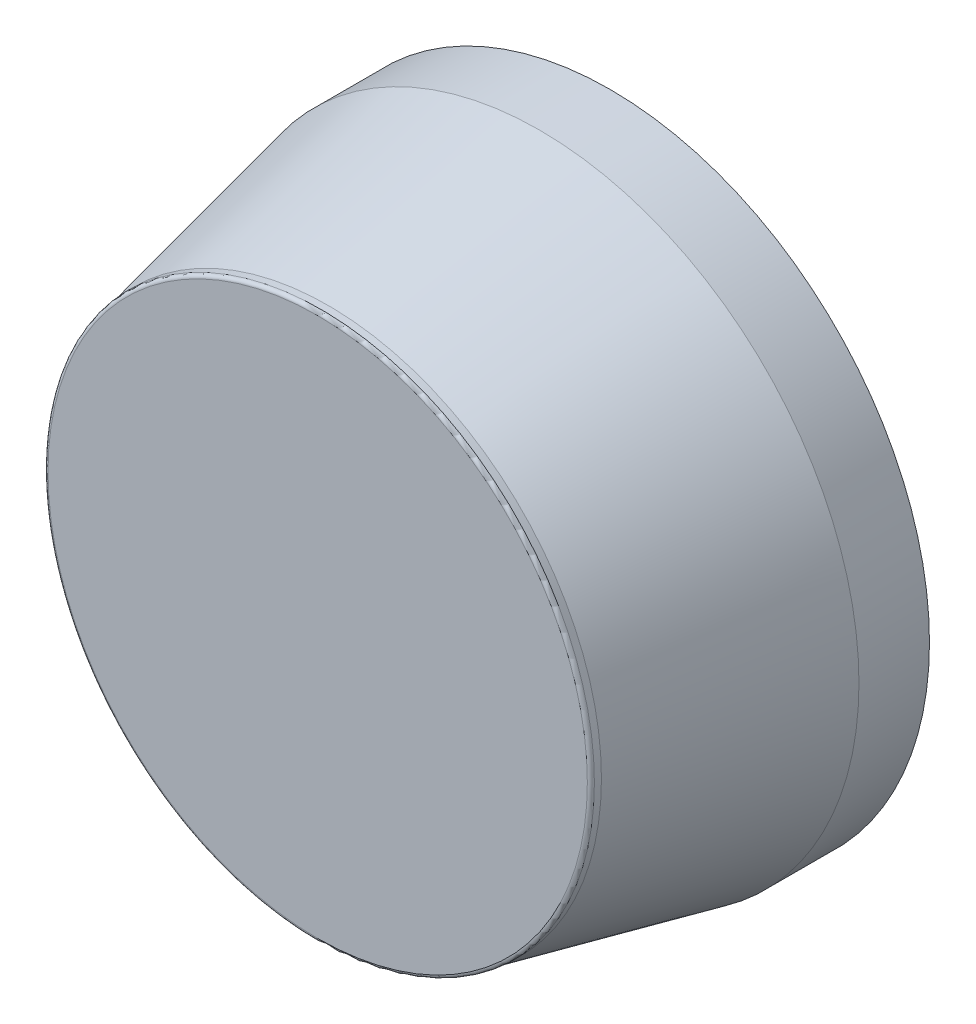
ISO-10303-21;
HEADER;
FILE_DESCRIPTION(('STEP AP214'),'2;1');
FILE_NAME('part.step','',(''),(''),'','','');
FILE_SCHEMA(('AUTOMOTIVE_DESIGN { 1 0 10303 214 1 1 1 1 }'));
ENDSEC;
DATA;
#1=APPLICATION_CONTEXT('core data for automotive mechanical design processes');
#2=APPLICATION_PROTOCOL_DEFINITION('international standard','automotive_design',2000,#1);
#3=PRODUCT_CONTEXT('',#1,'mechanical');
#4=PRODUCT('Part','Part','',(#3));
#5=PRODUCT_RELATED_PRODUCT_CATEGORY('part','',(#4));
#6=PRODUCT_DEFINITION_FORMATION('','',#4);
#7=PRODUCT_DEFINITION_CONTEXT('part definition',#1,'design');
#8=PRODUCT_DEFINITION('design','',#6,#7);
#9=PRODUCT_DEFINITION_SHAPE('','',#8);
#10=(LENGTH_UNIT() NAMED_UNIT(*) SI_UNIT(.MILLI.,.METRE.));
#11=(NAMED_UNIT(*) PLANE_ANGLE_UNIT() SI_UNIT($,.RADIAN.));
#12=(NAMED_UNIT(*) SI_UNIT($,.STERADIAN.) SOLID_ANGLE_UNIT());
#13=UNCERTAINTY_MEASURE_WITH_UNIT(LENGTH_MEASURE(1.E-05),#10,'distance_accuracy_value','');
#14=(GEOMETRIC_REPRESENTATION_CONTEXT(3) GLOBAL_UNCERTAINTY_ASSIGNED_CONTEXT((#13)) GLOBAL_UNIT_ASSIGNED_CONTEXT((#10,
#11,#12)) REPRESENTATION_CONTEXT('',''));
#15=CARTESIAN_POINT('',(0.,0.,0.));
#16=DIRECTION('',(0.,0.,1.));
#17=DIRECTION('',(1.,0.,0.));
#18=AXIS2_PLACEMENT_3D('',#15,#16,#17);
#19=CARTESIAN_POINT('',(0.,0.,0.));
#20=DIRECTION('',(0.,0.,1.));
#21=DIRECTION('',(1.,0.,0.));
#22=AXIS2_PLACEMENT_3D('',#19,#20,#21);
#23=PLANE('',#22);
#24=CARTESIAN_POINT('',(0.,0.,0.));
#25=DIRECTION('',(0.,0.,-1.));
#26=DIRECTION('',(-1.,0.,0.));
#27=AXIS2_PLACEMENT_3D('',#24,#25,#26);
#28=CIRCLE('',#27,87.05);
#29=CARTESIAN_POINT('',(-87.05,0.,0.));
#30=VERTEX_POINT('',#29);
#31=EDGE_CURVE('E256',#30,#30,#28,.T.);
#32=ORIENTED_EDGE('',*,*,#31,.F.);
#33=EDGE_LOOP('',(#32));
#34=FACE_BOUND('',#33,.T.);
#35=CARTESIAN_POINT('',(0.,0.,0.));
#36=DIRECTION('',(0.,0.,1.));
#37=DIRECTION('',(1.,0.,0.));
#38=AXIS2_PLACEMENT_3D('',#35,#36,#37);
#39=CIRCLE('',#38,87.55);
#40=CARTESIAN_POINT('',(87.55,0.,0.));
#41=VERTEX_POINT('',#40);
#42=EDGE_CURVE('E14',#41,#41,#39,.T.);
#43=ORIENTED_EDGE('',*,*,#42,.F.);
#44=EDGE_LOOP('',(#43));
#45=FACE_BOUND('',#44,.T.);
#46=ADVANCED_FACE('F58',(#34,#45),#23,.F.);
#47=CARTESIAN_POINT('',(0.,0.,60.));
#48=DIRECTION('',(0.,0.,-1.));
#49=DIRECTION('',(-1.,0.,0.));
#50=AXIS2_PLACEMENT_3D('',#47,#48,#49);
#51=CONICAL_SURFACE('',#50,74.5,0.206193925037338);
#52=CARTESIAN_POINT('',(0.,0.,19.7523852659333));
#53=DIRECTION('',(0.,0.,1.));
#54=DIRECTION('',(1.,0.,0.));
#55=AXIS2_PLACEMENT_3D('',#52,#53,#54);
#56=CIRCLE('',#55,82.918459415209);
#57=CARTESIAN_POINT('',(82.8389831686953,-3.62957013546675,19.7523852659333));
#58=VERTEX_POINT('',#57);
#59=CARTESIAN_POINT('',(82.8389831686953,3.62957013546675,19.7523852659333));
#60=VERTEX_POINT('',#59);
#61=EDGE_CURVE('E113',#58,#60,#56,.T.);
#62=ORIENTED_EDGE('',*,*,#61,.T.);
#63=CARTESIAN_POINT('',(106.521894313667,3.62957013546675,-93.388266422209));
#64=CARTESIAN_POINT('',(104.267554697963,3.62957013546675,-82.6168013026233));
#65=CARTESIAN_POINT('',(102.013137301452,3.62957013546675,-71.8453524622847));
#66=CARTESIAN_POINT('',(97.5041080196609,3.62957013546675,-50.3024954841445));
#67=CARTESIAN_POINT('',(95.2494961343817,3.62957013546675,-39.531087346343));
#68=CARTESIAN_POINT('',(88.4853103886251,3.62957013546675,-7.21693636504972));
#69=CARTESIAN_POINT('',(83.9753864073249,3.62957013546675,14.3257331939983));
#70=CARTESIAN_POINT('',(77.2093734275122,3.62957013546675,46.6395016317595));
#71=CARTESIAN_POINT('',(74.95384792538,3.62957013546675,57.4107184969279));
#72=CARTESIAN_POINT('',(70.4422981929135,3.62957013546675,78.9530477716162));
#73=CARTESIAN_POINT('',(68.1862739625795,3.62957013546675,89.7241601811361));
#74=CARTESIAN_POINT('',(63.6735687169315,3.62957013546675,111.266247499113));
#75=CARTESIAN_POINT('',(61.416887701613,3.62957013546675,122.037222407569));
#76=CARTESIAN_POINT('',(56.902585280628,3.62957013546675,143.578975184707));
#77=CARTESIAN_POINT('',(54.6449638749588,3.62957013546675,154.349753053387));
#78=CARTESIAN_POINT('',(52.3867304704901,3.62957013546675,165.120402637333));
#79=B_SPLINE_CURVE_WITH_KNOTS('',3,(#63,#64,#65,#66,#67,#68,#69,#70,#71,#72,#73,#74,#75,#76,#77,
#78),.UNSPECIFIED.,.F.,.F.,(4,2,2,2,2,2,2,4),(0.,33.0145206114035,66.0290412376977,
132.058082037686,165.072602658673,198.087123251434,231.101644067325,264.11616498096),.UNSPECIFIED.);
#80=CARTESIAN_POINT('',(76.3791954923787,3.62957013546675,50.6037314174006));
#81=VERTEX_POINT('',#80);
#82=EDGE_CURVE('E157',#60,#81,#79,.T.);
#83=ORIENTED_EDGE('',*,*,#82,.T.);
#84=CARTESIAN_POINT('',(0.,0.,50.6037314174006));
#85=DIRECTION('',(0.,0.,-1.));
#86=DIRECTION('',(-1.,0.,0.));
#87=AXIS2_PLACEMENT_3D('',#84,#85,#86);
#88=CIRCLE('',#87,76.465386178527);
#89=CARTESIAN_POINT('',(76.3791954923787,-3.62957013546675,50.6037314174006));
#90=VERTEX_POINT('',#89);
#91=EDGE_CURVE('E148',#81,#90,#88,.T.);
#92=ORIENTED_EDGE('',*,*,#91,.T.);
#93=CARTESIAN_POINT('',(52.3867304704901,-3.62957013546675,165.120402637333));
#94=CARTESIAN_POINT('',(53.8774871914149,-3.62957013546675,158.010297034399));
#95=CARTESIAN_POINT('',(55.3679640780721,-3.62957013546675,150.900132767956));
#96=CARTESIAN_POINT('',(58.3484594689947,-3.62957013546675,136.679708170281));
#97=CARTESIAN_POINT('',(59.8384779732607,-3.62957013546675,129.569447839049));
#98=CARTESIAN_POINT('',(64.3079978347317,-3.62957013546675,108.238554674721));
#99=CARTESIAN_POINT('',(67.2869635535305,-3.62957013546675,94.0178096093572));
#100=CARTESIAN_POINT('',(71.7988892925831,-3.62957013546675,72.4755590332958));
#101=CARTESIAN_POINT('',(73.3321983743611,-3.62957013546675,65.1541266256033));
#102=CARTESIAN_POINT('',(76.3986042664489,-3.62957013546675,50.5112173486582));
#103=CARTESIAN_POINT('',(77.9317010767584,-3.62957013546675,43.1897404794056));
#104=CARTESIAN_POINT('',(83.9753864604135,-3.62957013546675,14.3257330883743));
#105=CARTESIAN_POINT('',(88.4853104416184,-3.62957013546675,-7.21693658865077));
#106=CARTESIAN_POINT('',(95.2494961902927,-3.62957013546675,-39.5310876282908));
#107=CARTESIAN_POINT('',(97.5041080652887,-3.62957013546675,-50.3024957095505));
#108=CARTESIAN_POINT('',(102.013137326493,-3.62957013546675,-71.8453525745173));
#109=CARTESIAN_POINT('',(104.267554712702,-3.62957013546675,-82.6168013582245));
#110=CARTESIAN_POINT('',(106.521894313667,-3.62957013546675,-93.388266422209));
#111=B_SPLINE_CURVE_WITH_KNOTS('',3,(#93,#94,#95,#96,#97,#98,#99,#100,#101,#102,#103,#104,#105,
#106,#107,#108,#109,#110),.UNSPECIFIED.,.F.,.F.,(4,2,2,2,2,2,2,2,4),(0.,21.7941188118034,
43.5882375945602,87.1764749711537,109.617278947603,132.058082949682,198.087124094442,
231.101644548488,264.116164987368),.UNSPECIFIED.);
#112=EDGE_CURVE('E165',#90,#58,#111,.T.);
#113=ORIENTED_EDGE('',*,*,#112,.T.);
#114=EDGE_LOOP('',(#62,#83,#92,#113));
#115=FACE_BOUND('',#114,.T.);
#116=CARTESIAN_POINT('',(-14.0721111843541,-81.1992705277394,22.1850672093811));
#117=CARTESIAN_POINT('',(-13.6869517751517,-81.3469792553432,21.8036945494635));
#118=CARTESIAN_POINT('',(-13.2856151636885,-81.4912811713005,21.4373207953184));
#119=CARTESIAN_POINT('',(-12.4527259956811,-81.770834796593,20.7372079001883));
#120=CARTESIAN_POINT('',(-12.0211846644439,-81.9060898319547,20.403456744667));
#121=CARTESIAN_POINT('',(-11.1298903680505,-82.1654806370777,19.7708730719773));
#122=CARTESIAN_POINT('',(-10.6701311137044,-82.2896139127538,19.4720483826124));
#123=CARTESIAN_POINT('',(-9.72506298281396,-82.5246215970385,18.9118942538161));
#124=CARTESIAN_POINT('',(-9.23975429876669,-82.6354961055221,18.6505645319417));
#125=CARTESIAN_POINT('',(-8.2448348345217,-82.8423447853304,18.1669728270354));
#126=CARTESIAN_POINT('',(-7.73514644104721,-82.9382665689395,17.9448478559825));
#127=CARTESIAN_POINT('',(-6.69642656125811,-83.1129060485705,17.5430261530333));
#128=CARTESIAN_POINT('',(-6.16739491877762,-83.1916236056598,17.3633297637674));
#129=CARTESIAN_POINT('',(-5.0940234575416,-83.3302334639027,17.0484049038719));
#130=CARTESIAN_POINT('',(-4.54968872440454,-83.3901319404108,16.9131618455071));
#131=CARTESIAN_POINT('',(-3.44981378392863,-83.4898645427554,16.6886683774898));
#132=CARTESIAN_POINT('',(-2.89427422419243,-83.5296998247431,16.5994153176349));
#133=CARTESIAN_POINT('',(-1.80813416737995,-83.5867799210102,16.4717094277848));
#134=CARTESIAN_POINT('',(-1.27789629590743,-83.6051731007403,16.4306731750754));
#135=CARTESIAN_POINT('',(-0.215527026542658,-83.6229621163614,16.3909831167221));
#136=CARTESIAN_POINT('',(0.316604297123001,-83.6223586889241,16.3923276675877));
#137=CARTESIAN_POINT('',(1.37862275424351,-83.6021686880062,16.4373785659627));
#138=CARTESIAN_POINT('',(1.90851020849349,-83.5825849268719,16.4810786375872));
#139=CARTESIAN_POINT('',(2.9621219496743,-83.5248280656703,16.6103346485653));
#140=CARTESIAN_POINT('',(3.48584628160099,-83.4866551014059,16.6958902821444));
#141=CARTESIAN_POINT('',(4.50664886941871,-83.3939780946012,16.9045066669966));
#142=CARTESIAN_POINT('',(5.00404306581066,-83.3400369326341,17.0262769052929));
#143=CARTESIAN_POINT('',(5.98621085989614,-83.2163964640319,17.3069353884465));
#144=CARTESIAN_POINT('',(6.47098482821646,-83.1466976207468,17.4658225418965));
#145=CARTESIAN_POINT('',(7.42499745134018,-82.9927193269316,17.8192570988393));
#146=CARTESIAN_POINT('',(7.89423467599333,-82.9084385385608,18.013807774429));
#147=CARTESIAN_POINT('',(8.81447233296599,-82.7266659479057,18.4368847473871));
#148=CARTESIAN_POINT('',(9.26547207034877,-82.6291736428133,18.665412337892));
#149=CARTESIAN_POINT('',(10.1659768793669,-82.417993589609,19.1652423401978));
#150=CARTESIAN_POINT('',(10.6145690997402,-82.3037868779786,19.4379698852356));
#151=CARTESIAN_POINT('',(11.4869450916472,-82.0644318108917,20.0162856184016));
#152=CARTESIAN_POINT('',(11.9107283423116,-81.9392832258457,20.3218744960783));
#153=CARTESIAN_POINT('',(12.7315232172868,-81.6798809645729,20.9638078769685));
#154=CARTESIAN_POINT('',(13.1285279354108,-81.545624957311,21.3001602617999));
#155=CARTESIAN_POINT('',(13.8938457704317,-81.2699275773852,22.0013826662515));
#156=CARTESIAN_POINT('',(14.262156499248,-81.1284856082788,22.3662550544203));
#157=CARTESIAN_POINT('',(14.99659729751,-80.8288306485287,23.1524869592992));
#158=CARTESIAN_POINT('',(15.3602130777192,-80.6701795495013,23.5760307717703));
#159=CARTESIAN_POINT('',(16.0501994457206,-80.3490961438279,24.4511064070925));
#160=CARTESIAN_POINT('',(16.3765682126514,-80.1866636527912,24.9026395965716));
#161=CARTESIAN_POINT('',(16.9904249985646,-79.8603022191487,25.8311243391159));
#162=CARTESIAN_POINT('',(17.2779002391716,-79.6963728035238,26.3080841746436));
#163=CARTESIAN_POINT('',(17.8122016392818,-79.3693575467871,27.2845181463534));
#164=CARTESIAN_POINT('',(18.0590280557539,-79.2062717003488,27.7839921401828));
#165=CARTESIAN_POINT('',(18.5216792034614,-78.8751313973018,28.8279147672443));
#166=CARTESIAN_POINT('',(18.7353586825074,-78.7072317828131,29.3733653289294));
#167=CARTESIAN_POINT('',(19.1144907825984,-78.3772425538787,30.4825162744164));
#168=CARTESIAN_POINT('',(19.2799414858821,-78.2151531706949,31.0462173829401));
#169=CARTESIAN_POINT('',(19.560979289374,-77.8991045126998,32.1881113028464));
#170=CARTESIAN_POINT('',(19.6765705813268,-77.7451445553927,32.7663028916695));
#171=CARTESIAN_POINT('',(19.8564541585168,-77.4474500120436,33.9332088670379));
#172=CARTESIAN_POINT('',(19.9207483337743,-77.3037150494438,34.5219228650722));
#173=CARTESIAN_POINT('',(19.9960282505023,-77.0312611414703,35.6928704512013));
#174=CARTESIAN_POINT('',(20.0081261103234,-76.9022865446141,36.274972830357));
#175=CARTESIAN_POINT('',(19.9812474643851,-76.6573122604663,37.4407498680939));
#176=CARTESIAN_POINT('',(19.9422713268267,-76.5413124796435,38.02442451531));
#177=CARTESIAN_POINT('',(19.8128666563447,-76.3233799243298,39.1885064058347));
#178=CARTESIAN_POINT('',(19.7224547845461,-76.2214426079871,39.7689146457501));
#179=CARTESIAN_POINT('',(19.4902773190314,-76.0322269756859,40.921791717916));
#180=CARTESIAN_POINT('',(19.348514237241,-75.9449479429999,41.4942609370943));
#181=CARTESIAN_POINT('',(19.0235945778228,-75.7896707599209,42.5947420938917));
#182=CARTESIAN_POINT('',(18.8431853270375,-75.7208691308417,43.1234535829076));
#183=CARTESIAN_POINT('',(18.4381443462849,-75.5962422165921,44.1652255162314));
#184=CARTESIAN_POINT('',(18.2135143213784,-75.5404164312811,44.6782865631071));
#185=CARTESIAN_POINT('',(17.7214827100187,-75.4411442704943,45.6846583159925));
#186=CARTESIAN_POINT('',(17.4540848712751,-75.3976968112426,46.1779707478262));
#187=CARTESIAN_POINT('',(16.8783426675215,-75.3222482784803,47.1410111391305));
#188=CARTESIAN_POINT('',(16.5699984587399,-75.2902471612987,47.6107391885765));
#189=CARTESIAN_POINT('',(15.9224206890723,-75.2371350970665,48.5120421014013));
#190=CARTESIAN_POINT('',(15.5841021840293,-75.215782016668,48.9442607433386));
#191=CARTESIAN_POINT('',(14.87291270085,-75.1815305628257,49.7796099633284));
#192=CARTESIAN_POINT('',(14.5000424272131,-75.1686320170401,50.1827411341669));
#193=CARTESIAN_POINT('',(13.7223166750822,-75.1498550982614,50.9570746874983));
#194=CARTESIAN_POINT('',(13.3174597496318,-75.1439770430431,51.3282756239986));
#195=CARTESIAN_POINT('',(12.4785661677333,-75.1377446611679,52.0361486617104));
#196=CARTESIAN_POINT('',(12.0445290593178,-75.1373904200882,52.3728202278975));
#197=CARTESIAN_POINT('',(11.1447197069848,-75.1407267012862,53.0132592127458));
#198=CARTESIAN_POINT('',(10.6786215074518,-75.1444672742398,53.3165684695655));
#199=CARTESIAN_POINT('',(9.72281629427607,-75.1545736007814,53.8833227040659));
#200=CARTESIAN_POINT('',(9.23310914551157,-75.1609393693959,54.1467674535533));
#201=CARTESIAN_POINT('',(8.23345961891308,-75.1749083314751,54.631982840779));
#202=CARTESIAN_POINT('',(7.72351643526121,-75.1825115742548,54.8537518169279));
#203=CARTESIAN_POINT('',(6.6869384584546,-75.1977259800229,55.2540720328844));
#204=CARTESIAN_POINT('',(6.16030357451673,-75.2053371430542,55.4326230375917));
#205=CARTESIAN_POINT('',(5.08788829280752,-75.2196182958707,55.7470563528958));
#206=CARTESIAN_POINT('',(4.54195791170832,-75.2262765411723,55.8824279473871));
#207=CARTESIAN_POINT('',(3.44061549265031,-75.2377237267822,56.1067287450381));
#208=CARTESIAN_POINT('',(2.88520337896713,-75.2425126521542,56.1956575771108));
#209=CARTESIAN_POINT('',(1.76884999774773,-75.2496689738844,56.3264348238075));
#210=CARTESIAN_POINT('',(1.20790875759083,-75.2520363822275,56.3682834714469));
#211=CARTESIAN_POINT('',(0.0844910796522975,-75.2540866561114,56.4046000143308));
#212=CARTESIAN_POINT('',(-0.477985353901125,-75.2537695290385,56.3990680399388));
#213=CARTESIAN_POINT('',(-1.60014722159477,-75.2504865956033,56.3406802019791));
#214=CARTESIAN_POINT('',(-2.15983406198943,-75.2475222967917,56.2878512737387));
#215=CARTESIAN_POINT('',(-3.27275996235287,-75.2392780955856,56.1352858200647));
#216=CARTESIAN_POINT('',(-3.8259990179479,-75.2339981916205,56.0355492628142));
#217=CARTESIAN_POINT('',(-4.92212042475281,-75.221738710338,55.7898774162139));
#218=CARTESIAN_POINT('',(-5.46500245856689,-75.2147590810216,55.6439407134426));
#219=CARTESIAN_POINT('',(-6.53655086824895,-75.1999812721027,55.3069064641823));
#220=CARTESIAN_POINT('',(-7.06521722602908,-75.1921830914587,55.1158088602343));
#221=CARTESIAN_POINT('',(-8.1049048718763,-75.1768804998554,54.6896785007923));
#222=CARTESIAN_POINT('',(-8.61591558825583,-75.1693762645545,54.4546199449497));
#223=CARTESIAN_POINT('',(-9.61634944707852,-75.1559841972255,53.9423008237401));
#224=CARTESIAN_POINT('',(-10.1057725627712,-75.1500963672003,53.6650402060798));
#225=CARTESIAN_POINT('',(-11.0595633865556,-75.1414089532562,53.0702735850311));
#226=CARTESIAN_POINT('',(-11.5239307415345,-75.1386094128502,52.752767014664));
#227=CARTESIAN_POINT('',(-12.4242848865709,-75.1376725561532,52.0797735286625));
#228=CARTESIAN_POINT('',(-12.8602717521264,-75.1395352274594,51.7242867140701));
#229=CARTESIAN_POINT('',(-13.7001642174602,-75.1495325611237,50.9783966959841));
#230=CARTESIAN_POINT('',(-14.1041119193042,-75.1576588367801,50.5880407981311));
#231=CARTESIAN_POINT('',(-14.8776484274841,-75.1817608177133,49.7748684315877));
#232=CARTESIAN_POINT('',(-15.2472372542551,-75.1977365183215,49.3520519822035));
#233=CARTESIAN_POINT('',(-15.9493251122953,-75.239030048815,48.4771804474864));
#234=CARTESIAN_POINT('',(-16.2818288944195,-75.264346680267,48.0251291190962));
#235=CARTESIAN_POINT('',(-16.9073965780158,-75.325654009008,47.095199231907));
#236=CARTESIAN_POINT('',(-17.2004610356358,-75.3616445557575,46.6173210374351));
#237=CARTESIAN_POINT('',(-17.7410997630505,-75.4447859296338,45.6466134294051));
#238=CARTESIAN_POINT('',(-17.9892766833597,-75.4917658263017,45.1541049226387));
#239=CARTESIAN_POINT('',(-18.443715217703,-75.5979315850245,44.151388902471));
#240=CARTESIAN_POINT('',(-18.6499773134161,-75.657117306796,43.6411815925406));
#241=CARTESIAN_POINT('',(-19.0193517059769,-75.7881464965805,42.6070147464653));
#242=CARTESIAN_POINT('',(-19.1824676764636,-75.8599888860841,42.08305638532));
#243=CARTESIAN_POINT('',(-19.4647703760096,-76.016448500675,41.0253121297606));
#244=CARTESIAN_POINT('',(-19.5839570746162,-76.1010657346179,40.491526228534));
#245=CARTESIAN_POINT('',(-19.777401984582,-76.2822636941051,39.4214706462609));
#246=CARTESIAN_POINT('',(-19.8519391102781,-76.3787655125328,38.8852379253581));
#247=CARTESIAN_POINT('',(-19.9572638292988,-76.5835867975735,37.8107549039267));
#248=CARTESIAN_POINT('',(-19.9880517222054,-76.6919061832578,37.272504617239));
#249=CARTESIAN_POINT('',(-20.0062314166675,-76.9195209009929,36.1975146321319));
#250=CARTESIAN_POINT('',(-19.9936158440435,-77.0388180948046,35.6607752059102));
#251=CARTESIAN_POINT('',(-19.9256145148676,-77.287249606311,34.5923138868212));
#252=CARTESIAN_POINT('',(-19.8702277101316,-77.4163841650178,34.0605921172438));
#253=CARTESIAN_POINT('',(-19.7149658584996,-77.6876642579409,32.9875010225447));
#254=CARTESIAN_POINT('',(-19.613648425762,-77.8301022402527,32.4464143361748));
#255=CARTESIAN_POINT('',(-19.3673768537677,-78.1223754364903,31.376307216517));
#256=CARTESIAN_POINT('',(-19.2224213191974,-78.2722108868196,30.8472871696377));
#257=CARTESIAN_POINT('',(-18.8901843212434,-78.5774174615155,29.8044340622687));
#258=CARTESIAN_POINT('',(-18.7029075125383,-78.7327879755299,29.2905993386532));
#259=CARTESIAN_POINT('',(-18.2873299107328,-79.047172911692,28.2807396197176));
#260=CARTESIAN_POINT('',(-18.0590154807951,-79.2061885297394,27.7847206105143));
#261=CARTESIAN_POINT('',(-17.570128332007,-79.5210750920059,26.8276179092308));
#262=CARTESIAN_POINT('',(-17.3106959309089,-79.6769017775697,26.3659365499475));
#263=CARTESIAN_POINT('',(-16.7558610718738,-79.9881205051479,25.4642986250778));
#264=CARTESIAN_POINT('',(-16.4604451316187,-80.1435123617949,25.0243502897397));
#265=CARTESIAN_POINT('',(-15.835180286092,-80.4518033950904,24.1687271442296));
#266=CARTESIAN_POINT('',(-15.5053321842378,-80.6047026298038,23.7530517680411));
#267=CARTESIAN_POINT('',(-14.812883307991,-80.905918405741,22.9484601501314));
#268=CARTESIAN_POINT('',(-14.4502955385051,-81.0542367354534,22.5595333904889));
#269=CARTESIAN_POINT('',(-14.0721111843541,-81.1992705277394,22.1850672093811));
#270=B_SPLINE_CURVE_WITH_KNOTS('',3,(#116,#117,#118,#119,#120,#121,#122,#123,#124,#125,#126,
#127,#128,#129,#130,#131,#132,#133,#134,#135,#136,#137,#138,#139,#140,#141,#142,#143,#144,#145,
#146,#147,#148,#149,#150,#151,#152,#153,#154,#155,#156,#157,#158,#159,#160,#161,#162,#163,#164,
#165,#166,#167,#168,#169,#170,#171,#172,#173,#174,#175,#176,#177,#178,#179,#180,#181,#182,#183,
#184,#185,#186,#187,#188,#189,#190,#191,#192,#193,#194,#195,#196,#197,#198,#199,#200,#201,#202,
#203,#204,#205,#206,#207,#208,#209,#210,#211,#212,#213,#214,#215,#216,#217,#218,#219,#220,#221,
#222,#223,#224,#225,#226,#227,#228,#229,#230,#231,#232,#233,#234,#235,#236,#237,#238,#239,#240,
#241,#242,#243,#244,#245,#246,#247,#248,#249,#250,#251,#252,#253,#254,#255,#256,#257,#258,#259,
#260,#261,#262,#263,#264,#265,#266,#267,#268,#269),.UNSPECIFIED.,.T.,.F.,(4,2,2,2,2,2,2,2,2,2,2,
2,2,2,2,2,2,2,2,2,2,2,2,2,2,2,2,2,2,2,2,2,2,2,2,2,2,2,2,2,2,2,2,2,2,2,2,2,2,2,2,2,2,2,2,2,2,2,2,
2,2,2,2,2,2,2,2,2,2,2,2,2,2,2,2,2,4),(0.,1.68494132907572,3.36925975642475,5.05395495632664,
6.73863746504683,8.42909575959666,10.1195677049161,11.8094843524917,13.4993036066741,
15.093725768604,16.6880861003088,18.2822102292171,19.8763227124806,21.4193219762137,
22.9622758744071,24.5053714081805,26.0485256860776,27.6585957940592,29.2686996936749,
30.8792172640235,32.4898687281333,34.2289141825274,35.9680446156989,37.7077450556266,
39.4474344973091,41.2734230736001,43.0994842483016,44.9253918737604,46.7512322213217,
48.537972064462,50.3246990267616,52.1108475595725,53.8969087318984,55.5834272541238,
57.2698807604485,58.956186565079,60.6424859358983,62.288457954621,63.9343964198941,
65.5804093839429,67.2264478487145,68.8928326823456,70.5592270543722,72.2256878505051,
73.8921577117735,75.5776641358661,77.2631840272913,78.9486955764861,80.634202488145,
82.3187501240352,84.0032989025385,85.6878992221707,87.3725016851645,89.0580959489087,
90.7436923013167,92.4293124027758,94.1149280199522,95.7982905813419,97.4816521415448,
99.1647978029933,100.847919727314,102.506424158095,104.164909528509,105.823253643153,
107.481598907398,109.129473859454,110.777337527293,112.425481178365,114.073665221371,
115.777637150344,117.481663569029,119.185502662585,120.889908993643,122.544408182222,
124.199529196769,125.854611600435,127.509039437569),.UNSPECIFIED.);
#271=CARTESIAN_POINT('',(-14.0721111843541,-81.1992705277394,22.1850672093811));
#272=VERTEX_POINT('',#271);
#273=EDGE_CURVE('E173',#272,#272,#270,.T.);
#274=ORIENTED_EDGE('',*,*,#273,.T.);
#275=EDGE_LOOP('',(#274));
#276=FACE_BOUND('',#275,.T.);
#277=CARTESIAN_POINT('',(0.,0.,60.));
#278=DIRECTION('',(0.,0.,1.));
#279=DIRECTION('',(1.,0.,0.));
#280=AXIS2_PLACEMENT_3D('',#277,#278,#279);
#281=CIRCLE('',#280,74.5);
#282=CARTESIAN_POINT('',(74.5,0.,60.));
#283=VERTEX_POINT('',#282);
#284=EDGE_CURVE('E185',#283,#283,#281,.T.);
#285=ORIENTED_EDGE('',*,*,#284,.T.);
#286=EDGE_LOOP('',(#285));
#287=FACE_BOUND('',#286,.T.);
#288=ORIENTED_EDGE('',*,*,#31,.T.);
#289=EDGE_LOOP('',(#288));
#290=FACE_BOUND('',#289,.T.);
#291=CARTESIAN_POINT('',(0.,0.,19.7523852659333));
#292=DIRECTION('',(0.,0.,-1.));
#293=DIRECTION('',(-1.,0.,0.));
#294=AXIS2_PLACEMENT_3D('',#291,#292,#293);
#295=CIRCLE('',#294,82.918459415209);
#296=CARTESIAN_POINT('',(-82.8389831686953,-3.62957013546675,19.7523852659333));
#297=VERTEX_POINT('',#296);
#298=CARTESIAN_POINT('',(-82.8389831686953,3.62957013546675,19.7523852659333));
#299=VERTEX_POINT('',#298);
#300=EDGE_CURVE('E99',#297,#299,#295,.T.);
#301=ORIENTED_EDGE('',*,*,#300,.F.);
#302=CARTESIAN_POINT('',(-52.3867304704901,-3.62957013546675,165.120402637333));
#303=CARTESIAN_POINT('',(-53.8774871914149,-3.62957013546675,158.010297034399));
#304=CARTESIAN_POINT('',(-55.3679640780721,-3.62957013546675,150.900132767956));
#305=CARTESIAN_POINT('',(-58.3484594689947,-3.62957013546675,136.679708170281));
#306=CARTESIAN_POINT('',(-59.8384779732607,-3.62957013546675,129.569447839049));
#307=CARTESIAN_POINT('',(-64.3079978347317,-3.62957013546675,108.238554674721));
#308=CARTESIAN_POINT('',(-67.2869635535305,-3.62957013546675,94.0178096093572));
#309=CARTESIAN_POINT('',(-71.7988892925831,-3.62957013546675,72.4755590332958));
#310=CARTESIAN_POINT('',(-73.3321983743611,-3.62957013546675,65.1541266256033));
#311=CARTESIAN_POINT('',(-76.3986042664489,-3.62957013546675,50.5112173486582));
#312=CARTESIAN_POINT('',(-77.9317010767584,-3.62957013546675,43.1897404794056));
#313=CARTESIAN_POINT('',(-83.9753864604135,-3.62957013546675,14.3257330883743));
#314=CARTESIAN_POINT('',(-88.4853104416184,-3.62957013546675,-7.21693658865077));
#315=CARTESIAN_POINT('',(-95.2494961902927,-3.62957013546675,-39.5310876282908));
#316=CARTESIAN_POINT('',(-97.5041080652887,-3.62957013546675,-50.3024957095505));
#317=CARTESIAN_POINT('',(-102.013137326493,-3.62957013546675,-71.8453525745173));
#318=CARTESIAN_POINT('',(-104.267554712702,-3.62957013546675,-82.6168013582245));
#319=CARTESIAN_POINT('',(-106.521894313667,-3.62957013546675,-93.388266422209));
#320=B_SPLINE_CURVE_WITH_KNOTS('',3,(#302,#303,#304,#305,#306,#307,#308,#309,#310,#311,#312,
#313,#314,#315,#316,#317,#318,#319),.UNSPECIFIED.,.F.,.F.,(4,2,2,2,2,2,2,2,4),(0.,
21.7941188118034,43.5882375945602,87.1764749711537,109.617278947603,132.058082949682,
198.087124094442,231.101644548488,264.116164987368),.UNSPECIFIED.);
#321=CARTESIAN_POINT('',(-76.3791954923787,-3.62957013546675,50.6037314174006));
#322=VERTEX_POINT('',#321);
#323=EDGE_CURVE('E103',#322,#297,#320,.T.);
#324=ORIENTED_EDGE('',*,*,#323,.F.);
#325=CARTESIAN_POINT('',(0.,0.,50.6037314174006));
#326=DIRECTION('',(0.,0.,1.));
#327=DIRECTION('',(1.,0.,0.));
#328=AXIS2_PLACEMENT_3D('',#325,#326,#327);
#329=CIRCLE('',#328,76.465386178527);
#330=CARTESIAN_POINT('',(-76.3791954923787,3.62957013546675,50.6037314174006));
#331=VERTEX_POINT('',#330);
#332=EDGE_CURVE('E81',#331,#322,#329,.T.);
#333=ORIENTED_EDGE('',*,*,#332,.F.);
#334=CARTESIAN_POINT('',(-106.521894313667,3.62957013546675,-93.388266422209));
#335=CARTESIAN_POINT('',(-104.267554697963,3.62957013546675,-82.6168013026233));
#336=CARTESIAN_POINT('',(-102.013137301452,3.62957013546675,-71.8453524622847));
#337=CARTESIAN_POINT('',(-97.5041080196609,3.62957013546675,-50.3024954841445));
#338=CARTESIAN_POINT('',(-95.2494961343817,3.62957013546675,-39.531087346343));
#339=CARTESIAN_POINT('',(-88.4853103886251,3.62957013546675,-7.21693636504972));
#340=CARTESIAN_POINT('',(-83.9753864073249,3.62957013546675,14.3257331939983));
#341=CARTESIAN_POINT('',(-77.2093734275122,3.62957013546675,46.6395016317595));
#342=CARTESIAN_POINT('',(-74.95384792538,3.62957013546675,57.4107184969279));
#343=CARTESIAN_POINT('',(-70.4422981929135,3.62957013546675,78.9530477716162));
#344=CARTESIAN_POINT('',(-68.1862739625795,3.62957013546675,89.7241601811361));
#345=CARTESIAN_POINT('',(-63.6735687169315,3.62957013546675,111.266247499113));
#346=CARTESIAN_POINT('',(-61.416887701613,3.62957013546675,122.037222407569));
#347=CARTESIAN_POINT('',(-56.902585280628,3.62957013546675,143.578975184707));
#348=CARTESIAN_POINT('',(-54.6449638749588,3.62957013546675,154.349753053387));
#349=CARTESIAN_POINT('',(-52.3867304704901,3.62957013546675,165.120402637333));
#350=B_SPLINE_CURVE_WITH_KNOTS('',3,(#334,#335,#336,#337,#338,#339,#340,#341,#342,#343,#344,
#345,#346,#347,#348,#349),.UNSPECIFIED.,.F.,.F.,(4,2,2,2,2,2,2,4),(0.,33.0145206114035,
66.0290412376977,132.058082037686,165.072602658673,198.087123251434,231.101644067325,
264.11616498096),.UNSPECIFIED.);
#351=EDGE_CURVE('E76',#299,#331,#350,.T.);
#352=ORIENTED_EDGE('',*,*,#351,.F.);
#353=EDGE_LOOP('',(#301,#324,#333,#352));
#354=FACE_BOUND('',#353,.T.);
#355=ADVANCED_FACE('F101',(#115,#276,#287,#290,#354),#51,.F.);
#356=CARTESIAN_POINT('',(0.,0.,60.));
#357=DIRECTION('',(0.,0.,-1.));
#358=DIRECTION('',(-1.,0.,0.));
#359=AXIS2_PLACEMENT_3D('',#356,#357,#358);
#360=CONICAL_SURFACE('',#359,77.5,0.214164471835374);
#361=CARTESIAN_POINT('',(-14.0838421143338,-84.5573420426163,22.1966924138306));
#362=CARTESIAN_POINT('',(-13.6991913104393,-84.7055281282001,21.8151939371657));
#363=CARTESIAN_POINT('',(-13.2983452270701,-84.8502231960184,21.4486443155894));
#364=CARTESIAN_POINT('',(-12.4663997960343,-85.1304334964305,20.748098745747));
#365=CARTESIAN_POINT('',(-12.0353114701387,-85.2659520383807,20.4140910425216));
#366=CARTESIAN_POINT('',(-11.1448696475432,-85.525782702068,19.7809158475959));
#367=CARTESIAN_POINT('',(-10.6855087518856,-85.6500918691395,19.4817575357746));
#368=CARTESIAN_POINT('',(-9.74120151906781,-85.8853926813517,18.9208847007409));
#369=CARTESIAN_POINT('',(-9.2562554191629,-85.9963844499553,18.6591698303934));
#370=CARTESIAN_POINT('',(-8.262044579099,-86.2034379311577,18.1747706758217));
#371=CARTESIAN_POINT('',(-7.75270290899747,-86.299447708503,17.952221834799));
#372=CARTESIAN_POINT('',(-6.7146418526033,-86.474266358989,17.5495100002662));
#373=CARTESIAN_POINT('',(-6.18592230074139,-86.5530750851198,17.3693473690117));
#374=CARTESIAN_POINT('',(-5.11313944188691,-86.6918938292574,17.0534520433636));
#375=CARTESIAN_POINT('',(-4.56908128331049,-86.7519100749852,16.9177046293487));
#376=CARTESIAN_POINT('',(-3.46971689137179,-86.8519225950537,16.6921667931236));
#377=CARTESIAN_POINT('',(-2.91441130387396,-86.8919200155694,16.6023737397966));
#378=CARTESIAN_POINT('',(-1.82847993728583,-86.9493783955605,16.4735644925367));
#379=CARTESIAN_POINT('',(-1.29821730894471,-86.9679777820681,16.4319822876647));
#380=CARTESIAN_POINT('',(-0.235747629589601,-86.9862147663952,16.3912092941834));
#381=CARTESIAN_POINT('',(0.296459345787665,-86.9858530941248,16.3920168737697));
#382=CARTESIAN_POINT('',(1.35868110916691,-86.9661771719377,16.4360090750215));
#383=CARTESIAN_POINT('',(1.8886962098883,-86.9468657263877,16.4791874262594));
#384=CARTESIAN_POINT('',(2.94261412877149,-86.8896732362097,16.607421674378));
#385=CARTESIAN_POINT('',(3.46651699225694,-86.8517923293685,16.692477260527));
#386=CARTESIAN_POINT('',(4.48778859025784,-86.7596872408758,16.9001512987201));
#387=CARTESIAN_POINT('',(4.98547045002359,-86.7060234594452,17.0214837921161));
#388=CARTESIAN_POINT('',(5.96824790645771,-86.5829184520724,17.3013070853831));
#389=CARTESIAN_POINT('',(6.45334387103977,-86.5134776879067,17.4597967977036));
#390=CARTESIAN_POINT('',(7.40802422570031,-86.3599757608547,17.8124773562194));
#391=CARTESIAN_POINT('',(7.8776072236131,-86.2759132900044,18.006671396383));
#392=CARTESIAN_POINT('',(8.7985503399675,-86.094514681157,18.4290741869736));
#393=CARTESIAN_POINT('',(9.24990977191602,-85.9971780437173,18.6572842172877));
#394=CARTESIAN_POINT('',(10.1508530096635,-85.7862974044137,19.1563338339351));
#395=CARTESIAN_POINT('',(10.5995386626178,-85.6722389435274,19.4285772501382));
#396=CARTESIAN_POINT('',(11.4721264210008,-85.4330701650123,20.0059098298923));
#397=CARTESIAN_POINT('',(11.8960280163934,-85.3079596200733,20.3109996690295));
#398=CARTESIAN_POINT('',(12.7170766638583,-85.0484901181825,20.9519088467145));
#399=CARTESIAN_POINT('',(13.1142169524065,-84.9141288404629,21.2877359034403));
#400=CARTESIAN_POINT('',(13.879822623314,-84.6380417656445,21.9878707751788));
#401=CARTESIAN_POINT('',(14.2482856108347,-84.4963153551288,22.3521809637335));
#402=CARTESIAN_POINT('',(14.9829193337559,-84.195902594326,23.1370387951822));
#403=CARTESIAN_POINT('',(15.346590364753,-84.0367626434535,23.5597550854973));
#404=CARTESIAN_POINT('',(16.0367434994093,-83.7144042946049,24.4330779983066));
#405=CARTESIAN_POINT('',(16.3632238022259,-83.5511856995995,24.8836859697375));
#406=CARTESIAN_POINT('',(16.9773757459859,-83.2229023911986,25.8102078888122));
#407=CARTESIAN_POINT('',(17.2650347593982,-83.0578370959361,26.2861300006307));
#408=CARTESIAN_POINT('',(17.7998012474143,-82.7281455581742,27.2603709434985));
#409=CARTESIAN_POINT('',(18.0469088636602,-82.5635193141432,27.7586896963108));
#410=CARTESIAN_POINT('',(18.5106261951232,-82.2284913543917,28.8009337479689));
#411=CARTESIAN_POINT('',(18.7250266074502,-82.0582254988098,29.345887786096));
#412=CARTESIAN_POINT('',(19.1056292148004,-81.7229578528774,30.4539782194612));
#413=CARTESIAN_POINT('',(19.2718294652108,-81.5579562751504,31.0171153472692));
#414=CARTESIAN_POINT('',(19.5544310197912,-81.2354891280099,32.157842775375));
#415=CARTESIAN_POINT('',(19.6708351406509,-81.078023132798,32.7354322562271));
#416=CARTESIAN_POINT('',(19.8524312437434,-80.7726937108851,33.9011108358412));
#417=CARTESIAN_POINT('',(19.9176249342513,-80.6248299640236,34.4891995836998));
#418=CARTESIAN_POINT('',(19.9949262221748,-80.3430740623822,35.661014999217));
#419=CARTESIAN_POINT('',(20.007962818417,-80.2089792535835,36.2446314348355));
#420=CARTESIAN_POINT('',(19.9826969104121,-79.9532530138255,37.4135056160984));
#421=CARTESIAN_POINT('',(19.9443946393371,-79.8316215262627,37.9987633542763));
#422=CARTESIAN_POINT('',(19.816058044382,-79.601956893674,39.1660913986939));
#423=CARTESIAN_POINT('',(19.7260399369445,-79.4939194989121,39.7481626463831));
#424=CARTESIAN_POINT('',(19.4943465566979,-79.2920998515758,40.9044397367903));
#425=CARTESIAN_POINT('',(19.352673807422,-79.1983169029326,41.4786459623241));
#426=CARTESIAN_POINT('',(19.0273586810935,-79.029959201804,42.5834016527144));
#427=CARTESIAN_POINT('',(18.8464107111217,-78.9546183187777,43.1146293758966));
#428=CARTESIAN_POINT('',(18.4398307053334,-78.8167589548262,44.1614102354707));
#429=CARTESIAN_POINT('',(18.2142003221948,-78.7542399998277,44.6769639507871));
#430=CARTESIAN_POINT('',(17.7196966224745,-78.6415260436948,45.6882308047364));
#431=CARTESIAN_POINT('',(17.4508277787756,-78.5913297691735,46.1839459889858));
#432=CARTESIAN_POINT('',(16.8716681015156,-78.5024280597599,47.1516394171751));
#433=CARTESIAN_POINT('',(16.5613775562633,-78.4637225448941,47.6236178262994));
#434=CARTESIAN_POINT('',(15.9104078377679,-78.3975991209399,48.5278761471357));
#435=CARTESIAN_POINT('',(15.5707599168479,-78.3699076862158,48.960879129952));
#436=CARTESIAN_POINT('',(14.8566907447825,-78.3231652984126,49.7976771088578));
#437=CARTESIAN_POINT('',(14.4822702583685,-78.3041141553671,50.201472746939));
#438=CARTESIAN_POINT('',(13.7012489610541,-78.2733161545061,50.9769605635471));
#439=CARTESIAN_POINT('',(13.2946471266808,-78.2615695291037,51.3486517202588));
#440=CARTESIAN_POINT('',(12.4520960808114,-78.2439765672862,52.0572902150731));
#441=CARTESIAN_POINT('',(12.0161464661421,-78.2381303119468,52.3942370757051));
#442=CARTESIAN_POINT('',(11.1138608818142,-78.2308916943319,53.0339109882665));
#443=CARTESIAN_POINT('',(10.6472862386107,-78.2295399934986,53.3363018602152));
#444=CARTESIAN_POINT('',(9.69059050799669,-78.2299997258404,53.9011991783309));
#445=CARTESIAN_POINT('',(9.20046933955383,-78.2318111699018,54.1637054872272));
#446=CARTESIAN_POINT('',(8.20006906330203,-78.2372938394095,54.647020163224));
#447=CARTESIAN_POINT('',(7.68978918316882,-78.2409651361746,54.8678269308469));
#448=CARTESIAN_POINT('',(6.65262581154077,-78.2490117949226,55.2662022667954));
#449=CARTESIAN_POINT('',(6.12574221975979,-78.2533871611585,55.4437705739048));
#450=CARTESIAN_POINT('',(5.05313201101342,-78.2619201441885,55.7561529454445));
#451=CARTESIAN_POINT('',(4.50726164688222,-78.2660748264716,55.8904737645548));
#452=CARTESIAN_POINT('',(3.40614444973236,-78.2733412861761,56.112706075546));
#453=CARTESIAN_POINT('',(2.85089754620743,-78.2764530557517,56.200617218292));
#454=CARTESIAN_POINT('',(1.73496664634357,-78.2811174521294,56.3294040290869));
#455=CARTESIAN_POINT('',(1.17428263593847,-78.2826700748969,56.370279575419));
#456=CARTESIAN_POINT('',(0.0514626138309832,-78.2839731619112,56.4047030252616));
#457=CARTESIAN_POINT('',(-0.510673395371829,-78.2837236292584,56.3982510101908));
#458=CARTESIAN_POINT('',(-1.63277527502007,-78.281460128402,56.3380457070049));
#459=CARTESIAN_POINT('',(-2.19273946891729,-78.2794449961492,56.2842612127638));
#460=CARTESIAN_POINT('',(-3.30614345666343,-78.273968058819,56.129732167505));
#461=CARTESIAN_POINT('',(-3.85958324078818,-78.2705062515858,56.0289875465056));
#462=CARTESIAN_POINT('',(-4.95602346303533,-78.2627253978904,55.7812519940337));
#463=CARTESIAN_POINT('',(-5.49902360666468,-78.2584063272843,55.6342597599821));
#464=CARTESIAN_POINT('',(-6.57071776437194,-78.2497509135597,55.2950732269838));
#465=CARTESIAN_POINT('',(-7.09941176985305,-78.2454145704308,55.1028789008752));
#466=CARTESIAN_POINT('',(-8.13892492600908,-78.2377849973904,54.6745756273219));
#467=CARTESIAN_POINT('',(-8.64973782980186,-78.2344921288515,54.4384515110929));
#468=CARTESIAN_POINT('',(-9.64966712114598,-78.2301997416533,53.9240071290528));
#469=CARTESIAN_POINT('',(-10.1387834848352,-78.2292002255162,53.6456868168353));
#470=CARTESIAN_POINT('',(-11.0918305020692,-78.2308838164115,53.0488334802034));
#471=CARTESIAN_POINT('',(-11.555761127589,-78.2335669275417,52.7303004110445));
#472=CARTESIAN_POINT('',(-12.4551054044333,-78.2440945415646,52.0553144607306));
#473=CARTESIAN_POINT('',(-12.890519160399,-78.2519390255169,51.6988617187324));
#474=CARTESIAN_POINT('',(-13.7285891653677,-78.2742701074137,50.9516149657321));
#475=CARTESIAN_POINT('',(-14.1313279228664,-78.2887393209392,50.5609129868962));
#476=CARTESIAN_POINT('',(-14.902398500434,-78.3257802171584,49.747264164631));
#477=CARTESIAN_POINT('',(-15.2707303791743,-78.3483518860351,49.3243173761887));
#478=CARTESIAN_POINT('',(-15.9702834740654,-78.4029613029068,48.4494233251497));
#479=CARTESIAN_POINT('',(-16.3015092067899,-78.4349978970971,47.9974796026255));
#480=CARTESIAN_POINT('',(-16.9245326684582,-78.5097387470479,47.0680221850527));
#481=CARTESIAN_POINT('',(-17.2163308823217,-78.5524428715899,46.5905088045867));
#482=CARTESIAN_POINT('',(-17.7548327188105,-78.6488369651801,45.6202043484485));
#483=CARTESIAN_POINT('',(-18.002089622835,-78.7023715971742,45.1277047985732));
#484=CARTESIAN_POINT('',(-18.4546852591636,-78.8214305239827,44.1252112299877));
#485=CARTESIAN_POINT('',(-18.6600244479162,-78.8869546882264,43.6152174018461));
#486=CARTESIAN_POINT('',(-19.0275955435663,-79.0303449175378,42.5816580778838));
#487=CARTESIAN_POINT('',(-19.1898303627925,-79.1082101482186,42.0580935015897));
#488=CARTESIAN_POINT('',(-19.4704466420788,-79.2763162419366,41.0012955127843));
#489=CARTESIAN_POINT('',(-19.5888279548919,-79.3665571465262,40.4680620678139));
#490=CARTESIAN_POINT('',(-19.7811359782663,-79.5588715309728,39.3971935301835));
#491=CARTESIAN_POINT('',(-19.8551742839536,-79.6609145296519,38.859572967885));
#492=CARTESIAN_POINT('',(-19.959288593544,-79.8764061799545,37.7823820229551));
#493=CARTESIAN_POINT('',(-19.9893647803431,-79.9898547841249,37.242811648445));
#494=CARTESIAN_POINT('',(-20.0059182678886,-80.2272883497884,36.1652311121665));
#495=CARTESIAN_POINT('',(-19.9923872942176,-80.3512753065778,35.6272212658939));
#496=CARTESIAN_POINT('',(-19.9223528051395,-80.6086282002242,34.5562738352485));
#497=CARTESIAN_POINT('',(-19.8658482532909,-80.7419943632194,34.0233363735261));
#498=CARTESIAN_POINT('',(-19.7079475488943,-81.0216870178452,32.9467681154498));
#499=CARTESIAN_POINT('',(-19.6050147737257,-81.16830672205,32.4034388251838));
#500=CARTESIAN_POINT('',(-19.3551134305489,-81.4684820421057,31.3289597103122));
#501=CARTESIAN_POINT('',(-19.2081432653726,-81.6220379093488,30.7978103282054));
#502=CARTESIAN_POINT('',(-18.8714838231434,-81.9342177492678,29.7508766472846));
#503=CARTESIAN_POINT('',(-18.68180157809,-82.092840883998,29.2350898350286));
#504=CARTESIAN_POINT('',(-18.2610123797984,-82.4132790415705,28.2215171661176));
#505=CARTESIAN_POINT('',(-18.0298921030242,-82.5750950760869,27.7237371612229));
#506=CARTESIAN_POINT('',(-17.5397400913213,-82.8920506053177,26.7724363704291));
#507=CARTESIAN_POINT('',(-17.2825711983618,-83.0471394091167,26.3179373816298));
#508=CARTESIAN_POINT('',(-16.7332458369391,-83.3565366961459,25.4300660563919));
#509=CARTESIAN_POINT('',(-16.4410768990067,-83.5108448807367,24.9967013272931));
#510=CARTESIAN_POINT('',(-15.8232189211757,-83.8167412036099,24.1535637263965));
#511=CARTESIAN_POINT('',(-15.4975309634254,-83.9683294295197,23.7437900936351));
#512=CARTESIAN_POINT('',(-14.8142389827557,-84.266817716096,22.9502342141024));
#513=CARTESIAN_POINT('',(-14.4566471142118,-84.4137195334244,22.5664421663502));
#514=CARTESIAN_POINT('',(-14.0838421143338,-84.5573420426163,22.1966924138306));
#515=B_SPLINE_CURVE_WITH_KNOTS('',3,(#361,#362,#363,#364,#365,#366,#367,#368,#369,#370,#371,
#372,#373,#374,#375,#376,#377,#378,#379,#380,#381,#382,#383,#384,#385,#386,#387,#388,#389,#390,
#391,#392,#393,#394,#395,#396,#397,#398,#399,#400,#401,#402,#403,#404,#405,#406,#407,#408,#409,
#410,#411,#412,#413,#414,#415,#416,#417,#418,#419,#420,#421,#422,#423,#424,#425,#426,#427,#428,
#429,#430,#431,#432,#433,#434,#435,#436,#437,#438,#439,#440,#441,#442,#443,#444,#445,#446,#447,
#448,#449,#450,#451,#452,#453,#454,#455,#456,#457,#458,#459,#460,#461,#462,#463,#464,#465,#466,
#467,#468,#469,#470,#471,#472,#473,#474,#475,#476,#477,#478,#479,#480,#481,#482,#483,#484,#485,
#486,#487,#488,#489,#490,#491,#492,#493,#494,#495,#496,#497,#498,#499,#500,#501,#502,#503,#504,
#505,#506,#507,#508,#509,#510,#511,#512,#513,#514),.UNSPECIFIED.,.T.,.F.,(4,2,2,2,2,2,2,2,2,2,2,
2,2,2,2,2,2,2,2,2,2,2,2,2,2,2,2,2,2,2,2,2,2,2,2,2,2,2,2,2,2,2,2,2,2,2,2,2,2,2,2,2,2,2,2,2,2,2,2,
2,2,2,2,2,2,2,2,2,2,2,2,2,2,2,2,2,4),(0.,1.68453491195816,3.36845905377197,5.0528257694942,
6.73717686858443,8.42724294799764,10.1173234711087,11.8068433169463,13.4962664185041,
15.0909117748931,16.6854957450908,18.2798437692505,19.8741799634253,21.4176141925412,
22.9610032526924,24.5045304455746,26.0481157299406,27.657588155396,29.2670936908536,
30.8770044910524,32.4870495908093,34.2247938791491,35.9626222764832,37.7010145876344,
39.4394008266202,41.2667934556202,43.0942597996576,44.9216227604347,46.7489247615405,
48.5435307853308,50.3381286583622,52.1321641094367,53.9261119265367,55.6227192093018,
57.319263751008,59.0156329032743,60.7119902488667,62.3631028025753,64.0141790529868,
65.6653078341798,67.3164593028455,68.9825083850656,70.6485632011893,72.3146819095321,
73.9808106831316,75.6653191026813,77.3498401944252,79.0343656453008,80.7188881982505,
82.4045221833214,84.0901586803904,85.7758426582167,87.4615276489782,89.1477957840989,
90.8340657737502,92.5203376397254,94.2066033176728,95.888469087632,97.5703319895798,
99.251989951618,100.933627229029,102.592666973562,104.251688651588,105.910598209985,
107.569513338456,109.224235847592,110.87895147255,112.53398109672,114.189050638352,
115.903449546112,117.617910639993,119.332089675813,121.046820861844,122.679567275691,
124.312897127982,125.946174265395,127.578831811639),.UNSPECIFIED.);
#516=CARTESIAN_POINT('',(-14.0838421143338,-84.5573420426163,22.1966924138306));
#517=VERTEX_POINT('',#516);
#518=EDGE_CURVE('E176',#517,#517,#515,.T.);
#519=ORIENTED_EDGE('',*,*,#518,.F.);
#520=EDGE_LOOP('',(#519));
#521=FACE_BOUND('',#520,.T.);
#522=CARTESIAN_POINT('',(0.,0.,60.));
#523=DIRECTION('',(0.,0.,1.));
#524=DIRECTION('',(1.,0.,0.));
#525=AXIS2_PLACEMENT_3D('',#522,#523,#524);
#526=CIRCLE('',#525,77.5);
#527=CARTESIAN_POINT('',(77.5,0.,60.));
#528=VERTEX_POINT('',#527);
#529=EDGE_CURVE('E207',#528,#528,#526,.T.);
#530=ORIENTED_EDGE('',*,*,#529,.F.);
#531=EDGE_LOOP('',(#530));
#532=FACE_BOUND('',#531,.T.);
#533=CARTESIAN_POINT('',(0.,0.,0.));
#534=DIRECTION('',(0.,0.,1.));
#535=DIRECTION('',(1.,0.,0.));
#536=AXIS2_PLACEMENT_3D('',#533,#534,#535);
#537=CIRCLE('',#536,90.55);
#538=CARTESIAN_POINT('',(90.55,0.,0.));
#539=VERTEX_POINT('',#538);
#540=EDGE_CURVE('E246',#539,#539,#537,.T.);
#541=ORIENTED_EDGE('',*,*,#540,.T.);
#542=EDGE_LOOP('',(#541));
#543=FACE_BOUND('',#542,.T.);
#544=ADVANCED_FACE('F187',(#521,#532,#543),#360,.T.);
#545=CARTESIAN_POINT('',(0.,0.,60.));
#546=DIRECTION('',(0.,0.,1.));
#547=DIRECTION('',(1.,0.,0.));
#548=AXIS2_PLACEMENT_3D('',#545,#546,#547);
#549=PLANE('',#548);
#550=ORIENTED_EDGE('',*,*,#284,.F.);
#551=EDGE_LOOP('',(#550));
#552=FACE_BOUND('',#551,.T.);
#553=ADVANCED_FACE('F219',(#552),#549,.F.);
#554=CARTESIAN_POINT('',(0.,0.,63.));
#555=DIRECTION('',(0.,0.,-1.));
#556=DIRECTION('',(-1.,0.,0.));
#557=AXIS2_PLACEMENT_3D('',#554,#555,#556);
#558=CYLINDRICAL_SURFACE('',#557,77.5);
#559=CARTESIAN_POINT('',(0.,0.,62.));
#560=DIRECTION('',(0.,0.,1.));
#561=DIRECTION('',(1.,0.,0.));
#562=AXIS2_PLACEMENT_3D('',#559,#560,#561);
#563=CIRCLE('',#562,77.5);
#564=CARTESIAN_POINT('',(77.5,0.,62.));
#565=VERTEX_POINT('',#564);
#566=EDGE_CURVE('E68',#565,#565,#563,.F.);
#567=ORIENTED_EDGE('',*,*,#566,.T.);
#568=EDGE_LOOP('',(#567));
#569=FACE_BOUND('',#568,.T.);
#570=ORIENTED_EDGE('',*,*,#529,.T.);
#571=EDGE_LOOP('',(#570));
#572=FACE_BOUND('',#571,.T.);
#573=ADVANCED_FACE('F216',(#569,#572),#558,.T.);
#574=CARTESIAN_POINT('',(0.,0.,63.));
#575=DIRECTION('',(0.,0.,1.));
#576=DIRECTION('',(1.,0.,0.));
#577=AXIS2_PLACEMENT_3D('',#574,#575,#576);
#578=PLANE('',#577);
#579=CARTESIAN_POINT('',(0.,0.,63.));
#580=DIRECTION('',(0.,0.,1.));
#581=DIRECTION('',(1.,0.,0.));
#582=AXIS2_PLACEMENT_3D('',#579,#580,#581);
#583=CIRCLE('',#582,76.5);
#584=CARTESIAN_POINT('',(76.5,0.,63.));
#585=VERTEX_POINT('',#584);
#586=EDGE_CURVE('E210',#585,#585,#583,.T.);
#587=ORIENTED_EDGE('',*,*,#586,.T.);
#588=EDGE_LOOP('',(#587));
#589=FACE_BOUND('',#588,.T.);
#590=ADVANCED_FACE('F195',(#589),#578,.T.);
#591=CARTESIAN_POINT('',(0.,-159.,36.3968838271876));
#592=DIRECTION('',(0.,1.,0.));
#593=DIRECTION('',(0.,0.,1.));
#594=AXIS2_PLACEMENT_3D('',#591,#592,#593);
#595=CYLINDRICAL_SURFACE('',#594,20.);
#596=ORIENTED_EDGE('',*,*,#518,.T.);
#597=EDGE_LOOP('',(#596));
#598=FACE_BOUND('',#597,.T.);
#599=ORIENTED_EDGE('',*,*,#273,.F.);
#600=EDGE_LOOP('',(#599));
#601=FACE_BOUND('',#600,.T.);
#602=ADVANCED_FACE('F190',(#598,#601),#595,.F.);
#603=CARTESIAN_POINT('',(90.5511,3.62957013546675,19.7523852659333));
#604=DIRECTION('',(0.,0.,1.));
#605=DIRECTION('',(1.,0.,0.));
#606=AXIS2_PLACEMENT_3D('',#603,#604,#605);
#607=PLANE('',#606);
#608=ORIENTED_EDGE('',*,*,#61,.F.);
#609=DIRECTION('',(-1.,0.,0.));
#610=VECTOR('',#609,1.);
#611=CARTESIAN_POINT('',(90.5511,-3.62957013546675,19.7523852659333));
#612=LINE('',#611,#610);
#613=EDGE_CURVE('E108',#58,#297,#612,.T.);
#614=ORIENTED_EDGE('',*,*,#613,.T.);
#615=ORIENTED_EDGE('',*,*,#300,.T.);
#616=DIRECTION('',(-1.,0.,0.));
#617=VECTOR('',#616,1.);
#618=CARTESIAN_POINT('',(90.5511,3.62957013546675,19.7523852659333));
#619=LINE('',#618,#617);
#620=EDGE_CURVE('E174',#60,#299,#619,.T.);
#621=ORIENTED_EDGE('',*,*,#620,.F.);
#622=EDGE_LOOP('',(#608,#614,#615,#621));
#623=FACE_BOUND('',#622,.T.);
#624=ADVANCED_FACE('F112',(#623),#607,.F.);
#625=CARTESIAN_POINT('',(90.5511,3.62957013546675,50.6037314174006));
#626=DIRECTION('',(0.,-1.,0.));
#627=DIRECTION('',(0.,0.,-1.));
#628=AXIS2_PLACEMENT_3D('',#625,#626,#627);
#629=PLANE('',#628);
#630=ORIENTED_EDGE('',*,*,#82,.F.);
#631=ORIENTED_EDGE('',*,*,#620,.T.);
#632=ORIENTED_EDGE('',*,*,#351,.T.);
#633=DIRECTION('',(-1.,0.,0.));
#634=VECTOR('',#633,1.);
#635=CARTESIAN_POINT('',(90.5511,3.62957013546675,50.6037314174006));
#636=LINE('',#635,#634);
#637=EDGE_CURVE('E336',#81,#331,#636,.T.);
#638=ORIENTED_EDGE('',*,*,#637,.F.);
#639=EDGE_LOOP('',(#630,#631,#632,#638));
#640=FACE_BOUND('',#639,.T.);
#641=ADVANCED_FACE('F327',(#640),#629,.F.);
#642=CARTESIAN_POINT('',(90.5511,3.62957013546675,50.6037314174006));
#643=DIRECTION('',(0.,0.,-1.));
#644=DIRECTION('',(-1.,0.,0.));
#645=AXIS2_PLACEMENT_3D('',#642,#643,#644);
#646=PLANE('',#645);
#647=ORIENTED_EDGE('',*,*,#91,.F.);
#648=ORIENTED_EDGE('',*,*,#637,.T.);
#649=ORIENTED_EDGE('',*,*,#332,.T.);
#650=DIRECTION('',(-1.,0.,0.));
#651=VECTOR('',#650,1.);
#652=CARTESIAN_POINT('',(90.5511,-3.62957013546675,50.6037314174006));
#653=LINE('',#652,#651);
#654=EDGE_CURVE('E117',#90,#322,#653,.T.);
#655=ORIENTED_EDGE('',*,*,#654,.F.);
#656=EDGE_LOOP('',(#647,#648,#649,#655));
#657=FACE_BOUND('',#656,.T.);
#658=ADVANCED_FACE('F323',(#657),#646,.F.);
#659=CARTESIAN_POINT('',(90.5511,-3.62957013546675,50.6037314174006));
#660=DIRECTION('',(0.,1.,0.));
#661=DIRECTION('',(0.,0.,1.));
#662=AXIS2_PLACEMENT_3D('',#659,#660,#661);
#663=PLANE('',#662);
#664=ORIENTED_EDGE('',*,*,#112,.F.);
#665=ORIENTED_EDGE('',*,*,#654,.T.);
#666=ORIENTED_EDGE('',*,*,#323,.T.);
#667=ORIENTED_EDGE('',*,*,#613,.F.);
#668=EDGE_LOOP('',(#664,#665,#666,#667));
#669=FACE_BOUND('',#668,.T.);
#670=ADVANCED_FACE('F119',(#669),#663,.F.);
#671=CARTESIAN_POINT('',(0.,0.,62.));
#672=DIRECTION('',(0.,0.,1.));
#673=DIRECTION('',(1.,0.,0.));
#674=AXIS2_PLACEMENT_3D('',#671,#672,#673);
#675=TOROIDAL_SURFACE('',#674,76.5,1.);
#676=ORIENTED_EDGE('',*,*,#566,.F.);
#677=EDGE_LOOP('',(#676));
#678=FACE_BOUND('',#677,.T.);
#679=ORIENTED_EDGE('',*,*,#586,.F.);
#680=EDGE_LOOP('',(#679));
#681=FACE_BOUND('',#680,.T.);
#682=ADVANCED_FACE('F60',(#678,#681),#675,.T.);
#683=CARTESIAN_POINT('',(0.,0.,-20.));
#684=DIRECTION('',(0.,0.,1.));
#685=DIRECTION('',(1.,0.,0.));
#686=AXIS2_PLACEMENT_3D('',#683,#684,#685);
#687=CYLINDRICAL_SURFACE('',#686,90.55);
#688=CARTESIAN_POINT('',(0.,0.,-20.));
#689=DIRECTION('',(0.,0.,1.));
#690=DIRECTION('',(1.,0.,0.));
#691=AXIS2_PLACEMENT_3D('',#688,#689,#690);
#692=CIRCLE('',#691,90.55);
#693=CARTESIAN_POINT('',(90.55,0.,-20.));
#694=VERTEX_POINT('',#693);
#695=EDGE_CURVE('E147',#694,#694,#692,.T.);
#696=ORIENTED_EDGE('',*,*,#695,.T.);
#697=EDGE_LOOP('',(#696));
#698=FACE_BOUND('',#697,.T.);
#699=ORIENTED_EDGE('',*,*,#540,.F.);
#700=EDGE_LOOP('',(#699));
#701=FACE_BOUND('',#700,.T.);
#702=ADVANCED_FACE('F137',(#698,#701),#687,.T.);
#703=CARTESIAN_POINT('',(0.,0.,-20.));
#704=DIRECTION('',(0.,0.,1.));
#705=DIRECTION('',(1.,0.,0.));
#706=AXIS2_PLACEMENT_3D('',#703,#704,#705);
#707=PLANE('',#706);
#708=CARTESIAN_POINT('',(0.,0.,-20.));
#709=DIRECTION('',(0.,0.,1.));
#710=DIRECTION('',(1.,0.,0.));
#711=AXIS2_PLACEMENT_3D('',#708,#709,#710);
#712=CIRCLE('',#711,87.55);
#713=CARTESIAN_POINT('',(87.55,0.,-20.));
#714=VERTEX_POINT('',#713);
#715=EDGE_CURVE('E290',#714,#714,#712,.T.);
#716=ORIENTED_EDGE('',*,*,#715,.T.);
#717=EDGE_LOOP('',(#716));
#718=FACE_BOUND('',#717,.T.);
#719=ORIENTED_EDGE('',*,*,#695,.F.);
#720=EDGE_LOOP('',(#719));
#721=FACE_BOUND('',#720,.T.);
#722=ADVANCED_FACE('F281',(#718,#721),#707,.F.);
#723=CARTESIAN_POINT('',(0.,0.,-20.));
#724=DIRECTION('',(0.,0.,1.));
#725=DIRECTION('',(1.,0.,0.));
#726=AXIS2_PLACEMENT_3D('',#723,#724,#725);
#727=CYLINDRICAL_SURFACE('',#726,87.55);
#728=ORIENTED_EDGE('',*,*,#715,.F.);
#729=EDGE_LOOP('',(#728));
#730=FACE_BOUND('',#729,.T.);
#731=ORIENTED_EDGE('',*,*,#42,.T.);
#732=EDGE_LOOP('',(#731));
#733=FACE_BOUND('',#732,.T.);
#734=ADVANCED_FACE('F279',(#730,#733),#727,.F.);
#735=CLOSED_SHELL('',(#46,#355,#544,#553,#573,#590,#602,#624,#641,#658,#670,#682,#702,#722,#734));
#736=MANIFOLD_SOLID_BREP('B2',#735);
#737=ADVANCED_BREP_SHAPE_REPRESENTATION('',(#18,#736),#14);
#738=SHAPE_DEFINITION_REPRESENTATION(#9,#737);
ENDSEC;
END-ISO-10303-21;
